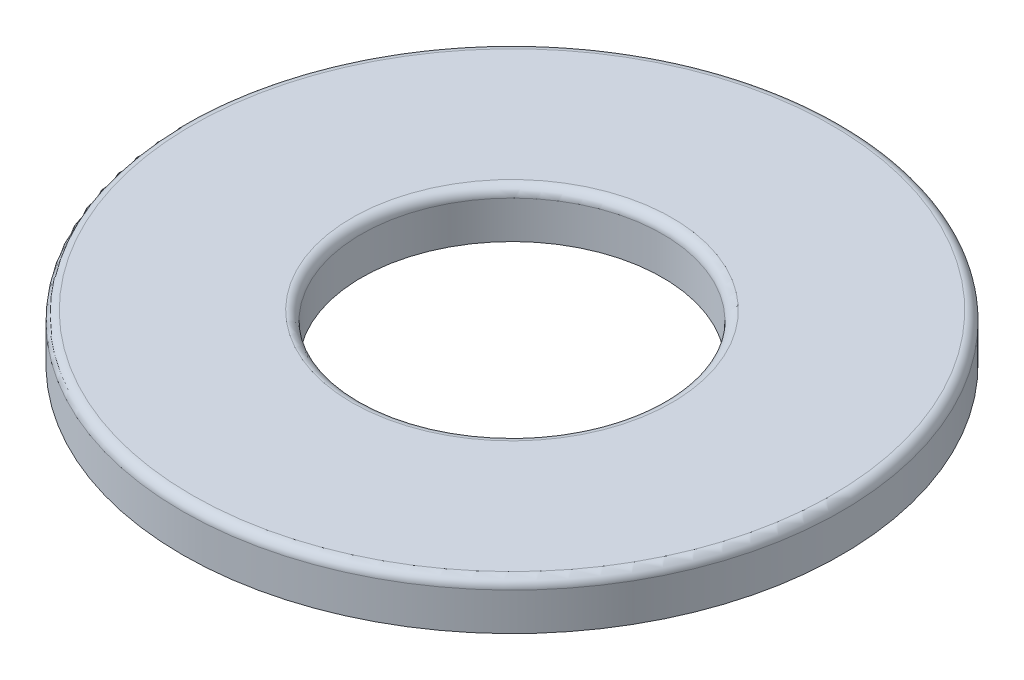
ISO-10303-21;
HEADER;
FILE_DESCRIPTION(('STEP AP214'),'2;1');
FILE_NAME('part.step','',(''),(''),'','','');
FILE_SCHEMA(('AUTOMOTIVE_DESIGN { 1 0 10303 214 1 1 1 1 }'));
ENDSEC;
DATA;
#1=APPLICATION_CONTEXT('core data for automotive mechanical design processes');
#2=APPLICATION_PROTOCOL_DEFINITION('international standard','automotive_design',2000,#1);
#3=PRODUCT_CONTEXT('',#1,'mechanical');
#4=PRODUCT('Part','Part','',(#3));
#5=PRODUCT_RELATED_PRODUCT_CATEGORY('part','',(#4));
#6=PRODUCT_DEFINITION_FORMATION('','',#4);
#7=PRODUCT_DEFINITION_CONTEXT('part definition',#1,'design');
#8=PRODUCT_DEFINITION('design','',#6,#7);
#9=PRODUCT_DEFINITION_SHAPE('','',#8);
#10=(LENGTH_UNIT() NAMED_UNIT(*) SI_UNIT(.MILLI.,.METRE.));
#11=(NAMED_UNIT(*) PLANE_ANGLE_UNIT() SI_UNIT($,.RADIAN.));
#12=(NAMED_UNIT(*) SI_UNIT($,.STERADIAN.) SOLID_ANGLE_UNIT());
#13=UNCERTAINTY_MEASURE_WITH_UNIT(LENGTH_MEASURE(1.E-05),#10,'distance_accuracy_value','');
#14=(GEOMETRIC_REPRESENTATION_CONTEXT(3) GLOBAL_UNCERTAINTY_ASSIGNED_CONTEXT((#13)) GLOBAL_UNIT_ASSIGNED_CONTEXT((#10,
#11,#12)) REPRESENTATION_CONTEXT('',''));
#15=CARTESIAN_POINT('',(0.,0.,0.));
#16=DIRECTION('',(0.,0.,1.));
#17=DIRECTION('',(1.,0.,0.));
#18=AXIS2_PLACEMENT_3D('',#15,#16,#17);
#19=CARTESIAN_POINT('',(0.,0.5,0.));
#20=DIRECTION('',(0.,1.,0.));
#21=DIRECTION('',(0.,0.,1.));
#22=AXIS2_PLACEMENT_3D('',#19,#20,#21);
#23=PLANE('',#22);
#24=CARTESIAN_POINT('',(0.,0.5,0.));
#25=DIRECTION('',(0.,1.,0.));
#26=DIRECTION('',(0.,0.,1.));
#27=AXIS2_PLACEMENT_3D('',#24,#25,#26);
#28=CIRCLE('',#27,1.7);
#29=CARTESIAN_POINT('',(0.,0.5,1.7));
#30=VERTEX_POINT('',#29);
#31=EDGE_CURVE('E48',#30,#30,#28,.F.);
#32=ORIENTED_EDGE('',*,*,#31,.T.);
#33=EDGE_LOOP('',(#32));
#34=FACE_BOUND('',#33,.T.);
#35=CARTESIAN_POINT('',(0.,0.5,0.));
#36=DIRECTION('',(0.,1.,0.));
#37=DIRECTION('',(0.,0.,1.));
#38=AXIS2_PLACEMENT_3D('',#35,#36,#37);
#39=CIRCLE('',#38,3.4);
#40=CARTESIAN_POINT('',(0.,0.5,3.4));
#41=VERTEX_POINT('',#40);
#42=EDGE_CURVE('E53',#41,#41,#39,.T.);
#43=ORIENTED_EDGE('',*,*,#42,.T.);
#44=EDGE_LOOP('',(#43));
#45=FACE_BOUND('',#44,.T.);
#46=ADVANCED_FACE('F40',(#34,#45),#23,.T.);
#47=CARTESIAN_POINT('',(0.,0.,0.));
#48=DIRECTION('',(0.,1.,0.));
#49=DIRECTION('',(0.,0.,1.));
#50=AXIS2_PLACEMENT_3D('',#47,#48,#49);
#51=PLANE('',#50);
#52=CARTESIAN_POINT('',(0.,0.,0.));
#53=DIRECTION('',(0.,1.,0.));
#54=DIRECTION('',(0.,0.,1.));
#55=AXIS2_PLACEMENT_3D('',#52,#53,#54);
#56=CIRCLE('',#55,3.5);
#57=CARTESIAN_POINT('',(0.,0.,3.5));
#58=VERTEX_POINT('',#57);
#59=EDGE_CURVE('E64',#58,#58,#56,.T.);
#60=ORIENTED_EDGE('',*,*,#59,.F.);
#61=EDGE_LOOP('',(#60));
#62=FACE_BOUND('',#61,.T.);
#63=CARTESIAN_POINT('',(0.,0.,0.));
#64=DIRECTION('',(0.,1.,0.));
#65=DIRECTION('',(0.,0.,1.));
#66=AXIS2_PLACEMENT_3D('',#63,#64,#65);
#67=CIRCLE('',#66,1.6);
#68=CARTESIAN_POINT('',(0.,0.,1.6));
#69=VERTEX_POINT('',#68);
#70=EDGE_CURVE('E68',#69,#69,#67,.T.);
#71=ORIENTED_EDGE('',*,*,#70,.T.);
#72=EDGE_LOOP('',(#71));
#73=FACE_BOUND('',#72,.T.);
#74=ADVANCED_FACE('F73',(#62,#73),#51,.F.);
#75=CARTESIAN_POINT('',(0.,0.5,0.));
#76=DIRECTION('',(0.,-1.,0.));
#77=DIRECTION('',(0.,0.,-1.));
#78=AXIS2_PLACEMENT_3D('',#75,#76,#77);
#79=CYLINDRICAL_SURFACE('',#78,3.5);
#80=CARTESIAN_POINT('',(0.,0.4,0.));
#81=DIRECTION('',(0.,1.,0.));
#82=DIRECTION('',(0.,0.,1.));
#83=AXIS2_PLACEMENT_3D('',#80,#81,#82);
#84=CIRCLE('',#83,3.5);
#85=CARTESIAN_POINT('',(0.,0.4,3.5));
#86=VERTEX_POINT('',#85);
#87=EDGE_CURVE('E10',#86,#86,#84,.F.);
#88=ORIENTED_EDGE('',*,*,#87,.T.);
#89=EDGE_LOOP('',(#88));
#90=FACE_BOUND('',#89,.T.);
#91=ORIENTED_EDGE('',*,*,#59,.T.);
#92=EDGE_LOOP('',(#91));
#93=FACE_BOUND('',#92,.T.);
#94=ADVANCED_FACE('F78',(#90,#93),#79,.T.);
#95=CARTESIAN_POINT('',(0.,0.5,0.));
#96=DIRECTION('',(0.,-1.,0.));
#97=DIRECTION('',(0.,0.,-1.));
#98=AXIS2_PLACEMENT_3D('',#95,#96,#97);
#99=CYLINDRICAL_SURFACE('',#98,1.6);
#100=CARTESIAN_POINT('',(0.,0.4,0.));
#101=DIRECTION('',(0.,1.,0.));
#102=DIRECTION('',(0.,0.,1.));
#103=AXIS2_PLACEMENT_3D('',#100,#101,#102);
#104=CIRCLE('',#103,1.6);
#105=CARTESIAN_POINT('',(0.,0.4,1.6));
#106=VERTEX_POINT('',#105);
#107=EDGE_CURVE('E58',#106,#106,#104,.T.);
#108=ORIENTED_EDGE('',*,*,#107,.T.);
#109=EDGE_LOOP('',(#108));
#110=FACE_BOUND('',#109,.T.);
#111=ORIENTED_EDGE('',*,*,#70,.F.);
#112=EDGE_LOOP('',(#111));
#113=FACE_BOUND('',#112,.T.);
#114=ADVANCED_FACE('F75',(#110,#113),#99,.F.);
#115=CARTESIAN_POINT('',(0.,0.4,0.));
#116=DIRECTION('',(0.,1.,0.));
#117=DIRECTION('',(0.,0.,1.));
#118=AXIS2_PLACEMENT_3D('',#115,#116,#117);
#119=TOROIDAL_SURFACE('',#118,1.7,0.1);
#120=ORIENTED_EDGE('',*,*,#31,.F.);
#121=EDGE_LOOP('',(#120));
#122=FACE_BOUND('',#121,.T.);
#123=ORIENTED_EDGE('',*,*,#107,.F.);
#124=EDGE_LOOP('',(#123));
#125=FACE_BOUND('',#124,.T.);
#126=ADVANCED_FACE('F77',(#122,#125),#119,.T.);
#127=CARTESIAN_POINT('',(0.,0.4,0.));
#128=DIRECTION('',(0.,1.,0.));
#129=DIRECTION('',(0.,0.,1.));
#130=AXIS2_PLACEMENT_3D('',#127,#128,#129);
#131=TOROIDAL_SURFACE('',#130,3.4,0.1);
#132=ORIENTED_EDGE('',*,*,#87,.F.);
#133=EDGE_LOOP('',(#132));
#134=FACE_BOUND('',#133,.T.);
#135=ORIENTED_EDGE('',*,*,#42,.F.);
#136=EDGE_LOOP('',(#135));
#137=FACE_BOUND('',#136,.T.);
#138=ADVANCED_FACE('F42',(#134,#137),#131,.T.);
#139=CLOSED_SHELL('',(#46,#74,#94,#114,#126,#138));
#140=MANIFOLD_SOLID_BREP('B2',#139);
#141=ADVANCED_BREP_SHAPE_REPRESENTATION('',(#18,#140),#14);
#142=SHAPE_DEFINITION_REPRESENTATION(#9,#141);
ENDSEC;
END-ISO-10303-21;
